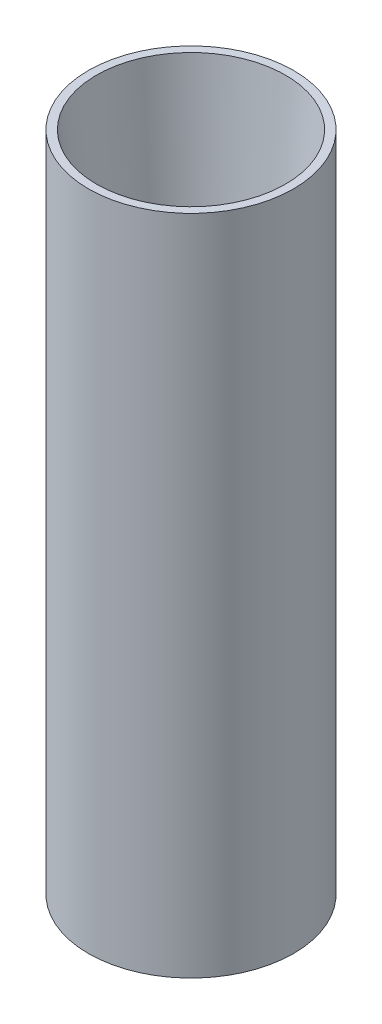
ISO-10303-21;
HEADER;
FILE_DESCRIPTION(('STEP AP214'),'2;1');
FILE_NAME('part.step','',(''),(''),'','','');
FILE_SCHEMA(('AUTOMOTIVE_DESIGN { 1 0 10303 214 1 1 1 1 }'));
ENDSEC;
DATA;
#1=APPLICATION_CONTEXT('core data for automotive mechanical design processes');
#2=APPLICATION_PROTOCOL_DEFINITION('international standard','automotive_design',2000,#1);
#3=PRODUCT_CONTEXT('',#1,'mechanical');
#4=PRODUCT('Part','Part','',(#3));
#5=PRODUCT_RELATED_PRODUCT_CATEGORY('part','',(#4));
#6=PRODUCT_DEFINITION_FORMATION('','',#4);
#7=PRODUCT_DEFINITION_CONTEXT('part definition',#1,'design');
#8=PRODUCT_DEFINITION('design','',#6,#7);
#9=PRODUCT_DEFINITION_SHAPE('','',#8);
#10=(LENGTH_UNIT() NAMED_UNIT(*) SI_UNIT(.MILLI.,.METRE.));
#11=(NAMED_UNIT(*) PLANE_ANGLE_UNIT() SI_UNIT($,.RADIAN.));
#12=(NAMED_UNIT(*) SI_UNIT($,.STERADIAN.) SOLID_ANGLE_UNIT());
#13=UNCERTAINTY_MEASURE_WITH_UNIT(LENGTH_MEASURE(1.E-05),#10,'distance_accuracy_value','');
#14=(GEOMETRIC_REPRESENTATION_CONTEXT(3) GLOBAL_UNCERTAINTY_ASSIGNED_CONTEXT((#13)) GLOBAL_UNIT_ASSIGNED_CONTEXT((#10,
#11,#12)) REPRESENTATION_CONTEXT('',''));
#15=CARTESIAN_POINT('',(0.,0.,0.));
#16=DIRECTION('',(0.,0.,1.));
#17=DIRECTION('',(1.,0.,0.));
#18=AXIS2_PLACEMENT_3D('',#15,#16,#17);
#19=CARTESIAN_POINT('',(0.,-82.,0.));
#20=DIRECTION('',(0.,1.,0.));
#21=DIRECTION('',(0.,0.,1.));
#22=AXIS2_PLACEMENT_3D('',#19,#20,#21);
#23=CYLINDRICAL_SURFACE('',#22,12.7);
#24=CARTESIAN_POINT('',(0.,-82.,0.));
#25=DIRECTION('',(0.,1.,0.));
#26=DIRECTION('',(0.,0.,1.));
#27=AXIS2_PLACEMENT_3D('',#24,#25,#26);
#28=CIRCLE('',#27,12.7);
#29=CARTESIAN_POINT('',(0.,-82.,12.7));
#30=VERTEX_POINT('',#29);
#31=EDGE_CURVE('E10',#30,#30,#28,.T.);
#32=ORIENTED_EDGE('',*,*,#31,.T.);
#33=EDGE_LOOP('',(#32));
#34=FACE_BOUND('',#33,.T.);
#35=CARTESIAN_POINT('',(0.,0.,0.));
#36=DIRECTION('',(0.,1.,0.));
#37=DIRECTION('',(0.,0.,1.));
#38=AXIS2_PLACEMENT_3D('',#35,#36,#37);
#39=CIRCLE('',#38,12.7);
#40=CARTESIAN_POINT('',(0.,0.,12.7));
#41=VERTEX_POINT('',#40);
#42=EDGE_CURVE('E35',#41,#41,#39,.T.);
#43=ORIENTED_EDGE('',*,*,#42,.F.);
#44=EDGE_LOOP('',(#43));
#45=FACE_BOUND('',#44,.T.);
#46=ADVANCED_FACE('F32',(#34,#45),#23,.T.);
#47=CARTESIAN_POINT('',(0.,-82.,0.));
#48=DIRECTION('',(0.,1.,0.));
#49=DIRECTION('',(0.,0.,1.));
#50=AXIS2_PLACEMENT_3D('',#47,#48,#49);
#51=PLANE('',#50);
#52=CARTESIAN_POINT('',(0.,-82.,0.));
#53=DIRECTION('',(0.,1.,0.));
#54=DIRECTION('',(0.,0.,1.));
#55=AXIS2_PLACEMENT_3D('',#52,#53,#54);
#56=CIRCLE('',#55,11.2);
#57=CARTESIAN_POINT('',(0.,-82.,11.2));
#58=VERTEX_POINT('',#57);
#59=EDGE_CURVE('E55',#58,#58,#56,.T.);
#60=ORIENTED_EDGE('',*,*,#59,.T.);
#61=EDGE_LOOP('',(#60));
#62=FACE_BOUND('',#61,.T.);
#63=ORIENTED_EDGE('',*,*,#31,.F.);
#64=EDGE_LOOP('',(#63));
#65=FACE_BOUND('',#64,.T.);
#66=ADVANCED_FACE('F62',(#62,#65),#51,.F.);
#67=CARTESIAN_POINT('',(0.,0.,0.));
#68=DIRECTION('',(0.,1.,0.));
#69=DIRECTION('',(0.,0.,1.));
#70=AXIS2_PLACEMENT_3D('',#67,#68,#69);
#71=PLANE('',#70);
#72=CARTESIAN_POINT('',(0.,0.,0.));
#73=DIRECTION('',(0.,1.,0.));
#74=DIRECTION('',(0.,0.,1.));
#75=AXIS2_PLACEMENT_3D('',#72,#73,#74);
#76=CIRCLE('',#75,11.7);
#77=CARTESIAN_POINT('',(0.,0.,11.7));
#78=VERTEX_POINT('',#77);
#79=EDGE_CURVE('E42',#78,#78,#76,.T.);
#80=ORIENTED_EDGE('',*,*,#79,.F.);
#81=EDGE_LOOP('',(#80));
#82=FACE_BOUND('',#81,.T.);
#83=ORIENTED_EDGE('',*,*,#42,.T.);
#84=EDGE_LOOP('',(#83));
#85=FACE_BOUND('',#84,.T.);
#86=ADVANCED_FACE('F92',(#82,#85),#71,.T.);
#87=CARTESIAN_POINT('',(0.,0.,0.));
#88=DIRECTION('',(0.,1.,0.));
#89=DIRECTION('',(0.,0.,1.));
#90=AXIS2_PLACEMENT_3D('',#87,#88,#89);
#91=CONICAL_SURFACE('',#90,11.7,0.0872664625997167);
#92=CARTESIAN_POINT('',(0.,-25.4,0.));
#93=DIRECTION('',(0.,1.,0.));
#94=DIRECTION('',(0.,0.,1.));
#95=AXIS2_PLACEMENT_3D('',#92,#93,#94);
#96=CIRCLE('',#95,9.47778794644152);
#97=CARTESIAN_POINT('',(0.,-25.4,9.47778794644152));
#98=VERTEX_POINT('',#97);
#99=EDGE_CURVE('E46',#98,#98,#96,.F.);
#100=ORIENTED_EDGE('',*,*,#99,.T.);
#101=EDGE_LOOP('',(#100));
#102=FACE_BOUND('',#101,.T.);
#103=ORIENTED_EDGE('',*,*,#79,.T.);
#104=EDGE_LOOP('',(#103));
#105=FACE_BOUND('',#104,.T.);
#106=ADVANCED_FACE('F86',(#102,#105),#91,.F.);
#107=CARTESIAN_POINT('',(0.,-25.4,0.));
#108=DIRECTION('',(0.,1.,0.));
#109=DIRECTION('',(0.,0.,1.));
#110=AXIS2_PLACEMENT_3D('',#107,#108,#109);
#111=PLANE('',#110);
#112=CARTESIAN_POINT('',(0.,-25.4,0.));
#113=DIRECTION('',(0.,1.,0.));
#114=DIRECTION('',(0.,0.,1.));
#115=AXIS2_PLACEMENT_3D('',#112,#113,#114);
#116=CIRCLE('',#115,10.7);
#117=CARTESIAN_POINT('',(0.,-25.4,10.7));
#118=VERTEX_POINT('',#117);
#119=EDGE_CURVE('E49',#118,#118,#116,.T.);
#120=ORIENTED_EDGE('',*,*,#119,.F.);
#121=EDGE_LOOP('',(#120));
#122=FACE_BOUND('',#121,.T.);
#123=ORIENTED_EDGE('',*,*,#99,.F.);
#124=EDGE_LOOP('',(#123));
#125=FACE_BOUND('',#124,.T.);
#126=ADVANCED_FACE('F80',(#122,#125),#111,.F.);
#127=CARTESIAN_POINT('',(0.,-78.78,0.));
#128=DIRECTION('',(0.,1.,0.));
#129=DIRECTION('',(0.,0.,1.));
#130=AXIS2_PLACEMENT_3D('',#127,#128,#129);
#131=CYLINDRICAL_SURFACE('',#130,10.7);
#132=CARTESIAN_POINT('',(0.,-78.78,0.));
#133=DIRECTION('',(0.,1.,0.));
#134=DIRECTION('',(0.,0.,1.));
#135=AXIS2_PLACEMENT_3D('',#132,#133,#134);
#136=CIRCLE('',#135,10.7);
#137=CARTESIAN_POINT('',(0.,-78.78,10.7));
#138=VERTEX_POINT('',#137);
#139=EDGE_CURVE('E52',#138,#138,#136,.F.);
#140=CARTESIAN_POINT('',(0.,-78.78,10.7));
#141=CARTESIAN_POINT('',(0.,-78.2239583333333,10.7));
#142=CARTESIAN_POINT('',(0.,-77.6679166666667,10.7));
#143=CARTESIAN_POINT('',(0.,-76.5558333333333,10.7));
#144=CARTESIAN_POINT('',(0.,-75.9997916666667,10.7));
#145=CARTESIAN_POINT('',(0.,-74.8877083333334,10.7));
#146=CARTESIAN_POINT('',(0.,-74.3316666666667,10.7));
#147=CARTESIAN_POINT('',(0.,-73.2195833333333,10.7));
#148=CARTESIAN_POINT('',(0.,-72.6635416666667,10.7));
#149=CARTESIAN_POINT('',(0.,-71.5514583333333,10.7));
#150=CARTESIAN_POINT('',(0.,-70.9954166666667,10.7));
#151=CARTESIAN_POINT('',(0.,-69.8833333333333,10.7));
#152=CARTESIAN_POINT('',(0.,-69.3272916666667,10.7));
#153=CARTESIAN_POINT('',(0.,-68.2152083333334,10.7));
#154=CARTESIAN_POINT('',(0.,-67.6591666666667,10.7));
#155=CARTESIAN_POINT('',(0.,-66.5470833333333,10.7));
#156=CARTESIAN_POINT('',(0.,-65.9910416666667,10.7));
#157=CARTESIAN_POINT('',(0.,-64.8789583333333,10.7));
#158=CARTESIAN_POINT('',(0.,-64.3229166666667,10.7));
#159=CARTESIAN_POINT('',(0.,-63.2108333333333,10.7));
#160=CARTESIAN_POINT('',(0.,-62.6547916666667,10.7));
#161=CARTESIAN_POINT('',(0.,-61.5427083333333,10.7));
#162=CARTESIAN_POINT('',(0.,-60.9866666666667,10.7));
#163=CARTESIAN_POINT('',(0.,-59.8745833333333,10.7));
#164=CARTESIAN_POINT('',(0.,-59.3185416666667,10.7));
#165=CARTESIAN_POINT('',(0.,-58.2064583333333,10.7));
#166=CARTESIAN_POINT('',(0.,-57.6504166666667,10.7));
#167=CARTESIAN_POINT('',(0.,-56.5383333333333,10.7));
#168=CARTESIAN_POINT('',(0.,-55.9822916666667,10.7));
#169=CARTESIAN_POINT('',(0.,-54.8702083333333,10.7));
#170=CARTESIAN_POINT('',(0.,-54.3141666666667,10.7));
#171=CARTESIAN_POINT('',(0.,-53.2020833333333,10.7));
#172=CARTESIAN_POINT('',(0.,-52.6460416666667,10.7));
#173=CARTESIAN_POINT('',(0.,-51.5339583333333,10.7));
#174=CARTESIAN_POINT('',(0.,-50.9779166666667,10.7));
#175=CARTESIAN_POINT('',(0.,-49.8658333333333,10.7));
#176=CARTESIAN_POINT('',(0.,-49.3097916666667,10.7));
#177=CARTESIAN_POINT('',(0.,-48.1977083333333,10.7));
#178=CARTESIAN_POINT('',(0.,-47.6416666666667,10.7));
#179=CARTESIAN_POINT('',(0.,-46.5295833333333,10.7));
#180=CARTESIAN_POINT('',(0.,-45.9735416666667,10.7));
#181=CARTESIAN_POINT('',(0.,-44.8614583333333,10.7));
#182=CARTESIAN_POINT('',(0.,-44.3054166666667,10.7));
#183=CARTESIAN_POINT('',(0.,-43.1933333333333,10.7));
#184=CARTESIAN_POINT('',(0.,-42.6372916666667,10.7));
#185=CARTESIAN_POINT('',(0.,-41.5252083333333,10.7));
#186=CARTESIAN_POINT('',(0.,-40.9691666666667,10.7));
#187=CARTESIAN_POINT('',(0.,-39.8570833333333,10.7));
#188=CARTESIAN_POINT('',(0.,-39.3010416666667,10.7));
#189=CARTESIAN_POINT('',(0.,-38.1889583333333,10.7));
#190=CARTESIAN_POINT('',(0.,-37.6329166666667,10.7));
#191=CARTESIAN_POINT('',(0.,-36.5208333333333,10.7));
#192=CARTESIAN_POINT('',(0.,-35.9647916666667,10.7));
#193=CARTESIAN_POINT('',(0.,-34.8527083333333,10.7));
#194=CARTESIAN_POINT('',(0.,-34.2966666666667,10.7));
#195=CARTESIAN_POINT('',(0.,-33.1845833333333,10.7));
#196=CARTESIAN_POINT('',(0.,-32.6285416666667,10.7));
#197=CARTESIAN_POINT('',(0.,-31.5164583333333,10.7));
#198=CARTESIAN_POINT('',(0.,-30.9604166666667,10.7));
#199=CARTESIAN_POINT('',(0.,-29.8483333333333,10.7));
#200=CARTESIAN_POINT('',(0.,-29.2922916666667,10.7));
#201=CARTESIAN_POINT('',(0.,-28.1802083333333,10.7));
#202=CARTESIAN_POINT('',(0.,-27.6241666666667,10.7));
#203=CARTESIAN_POINT('',(0.,-26.5120833333333,10.7));
#204=CARTESIAN_POINT('',(0.,-25.9560416666667,10.7));
#205=CARTESIAN_POINT('',(0.,-25.4,10.7));
#206=B_SPLINE_CURVE_WITH_KNOTS('',3,(#140,#141,#142,#143,#144,#145,#146,#147,#148,#149,#150,
#151,#152,#153,#154,#155,#156,#157,#158,#159,#160,#161,#162,#163,#164,#165,#166,#167,#168,#169,
#170,#171,#172,#173,#174,#175,#176,#177,#178,#179,#180,#181,#182,#183,#184,#185,#186,#187,#188,
#189,#190,#191,#192,#193,#194,#195,#196,#197,#198,#199,#200,#201,#202,#203,#204,#205),
.UNSPECIFIED.,.F.,.F.,(4,2,2,2,2,2,2,2,2,2,2,2,2,2,2,2,2,2,2,2,2,2,2,2,2,2,2,2,2,2,2,2,4),(0.,
1.66812500000001,3.33625000000001,5.004375,6.67250000000001,8.340625,10.00875,11.676875,13.345,
15.013125,16.68125,18.349375,20.0175,21.685625,23.35375,25.021875,26.69,28.358125,30.02625,
31.694375,33.3625,35.030625,36.69875,38.366875,40.035,41.703125,43.37125,45.039375,46.7075,
48.375625,50.04375,51.711875,53.38),.UNSPECIFIED.);
#207=EDGE_CURVE('BSEAM74',#138,#118,#206,.T.);
#208=ORIENTED_EDGE('',*,*,#139,.T.);
#209=ORIENTED_EDGE('',*,*,#119,.T.);
#210=ORIENTED_EDGE('',*,*,#207,.T.);
#211=ORIENTED_EDGE('',*,*,#207,.F.);
#212=EDGE_LOOP('',(#208,#210,#209,#211));
#213=FACE_BOUND('',#212,.T.);
#214=ADVANCED_FACE('F74',(#213),#131,.F.);
#215=CARTESIAN_POINT('',(0.,-78.78,0.));
#216=DIRECTION('',(0.,1.,0.));
#217=DIRECTION('',(0.,0.,1.));
#218=AXIS2_PLACEMENT_3D('',#215,#216,#217);
#219=PLANE('',#218);
#220=CARTESIAN_POINT('',(0.,-78.78,0.));
#221=DIRECTION('',(0.,1.,0.));
#222=DIRECTION('',(0.,0.,1.));
#223=AXIS2_PLACEMENT_3D('',#220,#221,#222);
#224=CIRCLE('',#223,11.2);
#225=CARTESIAN_POINT('',(0.,-78.78,11.2));
#226=VERTEX_POINT('',#225);
#227=EDGE_CURVE('E56',#226,#226,#224,.T.);
#228=ORIENTED_EDGE('',*,*,#227,.F.);
#229=EDGE_LOOP('',(#228));
#230=FACE_BOUND('',#229,.T.);
#231=ORIENTED_EDGE('',*,*,#139,.F.);
#232=EDGE_LOOP('',(#231));
#233=FACE_BOUND('',#232,.T.);
#234=ADVANCED_FACE('F68',(#230,#233),#219,.F.);
#235=CARTESIAN_POINT('',(0.,-82.,0.));
#236=DIRECTION('',(0.,1.,0.));
#237=DIRECTION('',(0.,0.,1.));
#238=AXIS2_PLACEMENT_3D('',#235,#236,#237);
#239=CYLINDRICAL_SURFACE('',#238,11.2);
#240=ORIENTED_EDGE('',*,*,#59,.F.);
#241=EDGE_LOOP('',(#240));
#242=FACE_BOUND('',#241,.T.);
#243=ORIENTED_EDGE('',*,*,#227,.T.);
#244=EDGE_LOOP('',(#243));
#245=FACE_BOUND('',#244,.T.);
#246=ADVANCED_FACE('F65',(#242,#245),#239,.F.);
#247=CLOSED_SHELL('',(#46,#66,#86,#106,#126,#214,#234,#246));
#248=MANIFOLD_SOLID_BREP('B2',#247);
#249=ADVANCED_BREP_SHAPE_REPRESENTATION('',(#18,#248),#14);
#250=SHAPE_DEFINITION_REPRESENTATION(#9,#249);
ENDSEC;
END-ISO-10303-21;
